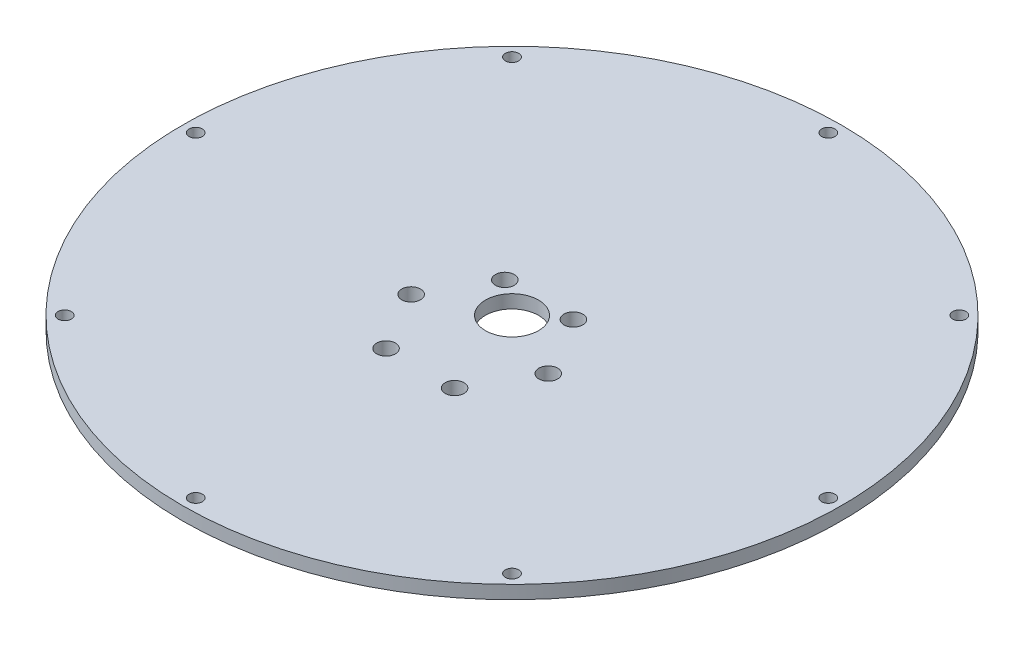
ISO-10303-21;
HEADER;
FILE_DESCRIPTION(('STEP AP214'),'2;1');
FILE_NAME('part.step','',(''),(''),'','','');
FILE_SCHEMA(('AUTOMOTIVE_DESIGN { 1 0 10303 214 1 1 1 1 }'));
ENDSEC;
DATA;
#1=APPLICATION_CONTEXT('core data for automotive mechanical design processes');
#2=APPLICATION_PROTOCOL_DEFINITION('international standard','automotive_design',2000,#1);
#3=PRODUCT_CONTEXT('',#1,'mechanical');
#4=PRODUCT('Part','Part','',(#3));
#5=PRODUCT_RELATED_PRODUCT_CATEGORY('part','',(#4));
#6=PRODUCT_DEFINITION_FORMATION('','',#4);
#7=PRODUCT_DEFINITION_CONTEXT('part definition',#1,'design');
#8=PRODUCT_DEFINITION('design','',#6,#7);
#9=PRODUCT_DEFINITION_SHAPE('','',#8);
#10=(LENGTH_UNIT() NAMED_UNIT(*) SI_UNIT(.MILLI.,.METRE.));
#11=(NAMED_UNIT(*) PLANE_ANGLE_UNIT() SI_UNIT($,.RADIAN.));
#12=(NAMED_UNIT(*) SI_UNIT($,.STERADIAN.) SOLID_ANGLE_UNIT());
#13=UNCERTAINTY_MEASURE_WITH_UNIT(LENGTH_MEASURE(1.E-05),#10,'distance_accuracy_value','');
#14=(GEOMETRIC_REPRESENTATION_CONTEXT(3) GLOBAL_UNCERTAINTY_ASSIGNED_CONTEXT((#13)) GLOBAL_UNIT_ASSIGNED_CONTEXT((#10,
#11,#12)) REPRESENTATION_CONTEXT('',''));
#15=CARTESIAN_POINT('',(0.,0.,0.));
#16=DIRECTION('',(0.,0.,1.));
#17=DIRECTION('',(1.,0.,0.));
#18=AXIS2_PLACEMENT_3D('',#15,#16,#17);
#19=CARTESIAN_POINT('',(0.,3.,0.));
#20=DIRECTION('',(0.,-1.,0.));
#21=DIRECTION('',(0.,0.,-1.));
#22=AXIS2_PLACEMENT_3D('',#19,#20,#21);
#23=CYLINDRICAL_SURFACE('',#22,5.99999999999999);
#24=CARTESIAN_POINT('',(0.,3.,0.));
#25=DIRECTION('',(0.,1.,0.));
#26=DIRECTION('',(0.,0.,1.));
#27=AXIS2_PLACEMENT_3D('',#24,#25,#26);
#28=CIRCLE('',#27,5.99999999999999);
#29=CARTESIAN_POINT('',(0.,3.,5.99999999999999));
#30=VERTEX_POINT('',#29);
#31=EDGE_CURVE('E49',#30,#30,#28,.T.);
#32=ORIENTED_EDGE('',*,*,#31,.T.);
#33=EDGE_LOOP('',(#32));
#34=FACE_BOUND('',#33,.T.);
#35=CARTESIAN_POINT('',(0.,0.,0.));
#36=DIRECTION('',(0.,1.,0.));
#37=DIRECTION('',(0.,0.,1.));
#38=AXIS2_PLACEMENT_3D('',#35,#36,#37);
#39=CIRCLE('',#38,5.99999999999999);
#40=CARTESIAN_POINT('',(0.,0.,5.99999999999999));
#41=VERTEX_POINT('',#40);
#42=EDGE_CURVE('E99',#41,#41,#39,.T.);
#43=ORIENTED_EDGE('',*,*,#42,.F.);
#44=EDGE_LOOP('',(#43));
#45=FACE_BOUND('',#44,.T.);
#46=ADVANCED_FACE('F41',(#34,#45),#23,.F.);
#47=CARTESIAN_POINT('',(7.75,3.,20.7233937586588));
#48=DIRECTION('',(0.,-1.,0.));
#49=DIRECTION('',(0.,0.,-1.));
#50=AXIS2_PLACEMENT_3D('',#47,#48,#49);
#51=CYLINDRICAL_SURFACE('',#50,2.12500000000002);
#52=CARTESIAN_POINT('',(7.75,3.,20.7233937586588));
#53=DIRECTION('',(0.,1.,0.));
#54=DIRECTION('',(0.,0.,1.));
#55=AXIS2_PLACEMENT_3D('',#52,#53,#54);
#56=CIRCLE('',#55,2.12500000000002);
#57=CARTESIAN_POINT('',(7.75,3.,22.8483937586588));
#58=VERTEX_POINT('',#57);
#59=EDGE_CURVE('E54',#58,#58,#56,.T.);
#60=ORIENTED_EDGE('',*,*,#59,.T.);
#61=EDGE_LOOP('',(#60));
#62=FACE_BOUND('',#61,.T.);
#63=CARTESIAN_POINT('',(7.75,0.,20.7233937586588));
#64=DIRECTION('',(0.,1.,0.));
#65=DIRECTION('',(0.,0.,1.));
#66=AXIS2_PLACEMENT_3D('',#63,#64,#65);
#67=CIRCLE('',#66,2.12500000000002);
#68=CARTESIAN_POINT('',(7.75,0.,22.8483937586588));
#69=VERTEX_POINT('',#68);
#70=EDGE_CURVE('E97',#69,#69,#67,.T.);
#71=ORIENTED_EDGE('',*,*,#70,.F.);
#72=EDGE_LOOP('',(#71));
#73=FACE_BOUND('',#72,.T.);
#74=ADVANCED_FACE('F150',(#62,#73),#51,.F.);
#75=CARTESIAN_POINT('',(-7.75,3.,20.7233937586588));
#76=DIRECTION('',(0.,-1.,0.));
#77=DIRECTION('',(0.,0.,-1.));
#78=AXIS2_PLACEMENT_3D('',#75,#76,#77);
#79=CYLINDRICAL_SURFACE('',#78,2.12500000000001);
#80=CARTESIAN_POINT('',(-7.75,3.,20.7233937586588));
#81=DIRECTION('',(0.,1.,0.));
#82=DIRECTION('',(0.,0.,1.));
#83=AXIS2_PLACEMENT_3D('',#80,#81,#82);
#84=CIRCLE('',#83,2.12500000000001);
#85=CARTESIAN_POINT('',(-7.75,3.,22.8483937586588));
#86=VERTEX_POINT('',#85);
#87=EDGE_CURVE('E145',#86,#86,#84,.T.);
#88=ORIENTED_EDGE('',*,*,#87,.T.);
#89=EDGE_LOOP('',(#88));
#90=FACE_BOUND('',#89,.T.);
#91=CARTESIAN_POINT('',(-7.75,0.,20.7233937586588));
#92=DIRECTION('',(0.,1.,0.));
#93=DIRECTION('',(0.,0.,1.));
#94=AXIS2_PLACEMENT_3D('',#91,#92,#93);
#95=CIRCLE('',#94,2.12500000000001);
#96=CARTESIAN_POINT('',(-7.75,0.,22.8483937586588));
#97=VERTEX_POINT('',#96);
#98=EDGE_CURVE('E94',#97,#97,#95,.T.);
#99=ORIENTED_EDGE('',*,*,#98,.F.);
#100=EDGE_LOOP('',(#99));
#101=FACE_BOUND('',#100,.T.);
#102=ADVANCED_FACE('F169',(#90,#101),#79,.F.);
#103=CARTESIAN_POINT('',(-15.5,3.,7.3));
#104=DIRECTION('',(0.,-1.,0.));
#105=DIRECTION('',(0.,0.,-1.));
#106=AXIS2_PLACEMENT_3D('',#103,#104,#105);
#107=CYLINDRICAL_SURFACE('',#106,2.125);
#108=CARTESIAN_POINT('',(-15.5,3.,7.3));
#109=DIRECTION('',(0.,1.,0.));
#110=DIRECTION('',(0.,0.,1.));
#111=AXIS2_PLACEMENT_3D('',#108,#109,#110);
#112=CIRCLE('',#111,2.125);
#113=CARTESIAN_POINT('',(-15.5,3.,9.425));
#114=VERTEX_POINT('',#113);
#115=EDGE_CURVE('E142',#114,#114,#112,.T.);
#116=ORIENTED_EDGE('',*,*,#115,.T.);
#117=EDGE_LOOP('',(#116));
#118=FACE_BOUND('',#117,.T.);
#119=CARTESIAN_POINT('',(-15.5,0.,7.3));
#120=DIRECTION('',(0.,1.,0.));
#121=DIRECTION('',(0.,0.,1.));
#122=AXIS2_PLACEMENT_3D('',#119,#120,#121);
#123=CIRCLE('',#122,2.125);
#124=CARTESIAN_POINT('',(-15.5,0.,9.425));
#125=VERTEX_POINT('',#124);
#126=EDGE_CURVE('E91',#125,#125,#123,.T.);
#127=ORIENTED_EDGE('',*,*,#126,.F.);
#128=EDGE_LOOP('',(#127));
#129=FACE_BOUND('',#128,.T.);
#130=ADVANCED_FACE('F176',(#118,#129),#107,.F.);
#131=CARTESIAN_POINT('',(-7.75000000000001,3.,-6.12339375865879));
#132=DIRECTION('',(0.,-1.,0.));
#133=DIRECTION('',(0.,0.,-1.));
#134=AXIS2_PLACEMENT_3D('',#131,#132,#133);
#135=CYLINDRICAL_SURFACE('',#134,2.12500000000001);
#136=CARTESIAN_POINT('',(-7.75000000000001,3.,-6.12339375865879));
#137=DIRECTION('',(0.,1.,0.));
#138=DIRECTION('',(0.,0.,1.));
#139=AXIS2_PLACEMENT_3D('',#136,#137,#138);
#140=CIRCLE('',#139,2.12500000000001);
#141=CARTESIAN_POINT('',(-7.75000000000001,3.,-3.99839375865878));
#142=VERTEX_POINT('',#141);
#143=EDGE_CURVE('E139',#142,#142,#140,.T.);
#144=ORIENTED_EDGE('',*,*,#143,.T.);
#145=EDGE_LOOP('',(#144));
#146=FACE_BOUND('',#145,.T.);
#147=CARTESIAN_POINT('',(-7.75000000000001,0.,-6.12339375865879));
#148=DIRECTION('',(0.,1.,0.));
#149=DIRECTION('',(0.,0.,1.));
#150=AXIS2_PLACEMENT_3D('',#147,#148,#149);
#151=CIRCLE('',#150,2.12500000000001);
#152=CARTESIAN_POINT('',(-7.75000000000001,0.,-3.99839375865878));
#153=VERTEX_POINT('',#152);
#154=EDGE_CURVE('E88',#153,#153,#151,.T.);
#155=ORIENTED_EDGE('',*,*,#154,.F.);
#156=EDGE_LOOP('',(#155));
#157=FACE_BOUND('',#156,.T.);
#158=ADVANCED_FACE('F180',(#146,#157),#135,.F.);
#159=CARTESIAN_POINT('',(7.74999999999999,3.,-6.1233937586588));
#160=DIRECTION('',(0.,-1.,0.));
#161=DIRECTION('',(0.,0.,-1.));
#162=AXIS2_PLACEMENT_3D('',#159,#160,#161);
#163=CYLINDRICAL_SURFACE('',#162,2.125);
#164=CARTESIAN_POINT('',(7.74999999999999,3.,-6.1233937586588));
#165=DIRECTION('',(0.,1.,0.));
#166=DIRECTION('',(0.,0.,1.));
#167=AXIS2_PLACEMENT_3D('',#164,#165,#166);
#168=CIRCLE('',#167,2.125);
#169=CARTESIAN_POINT('',(7.74999999999999,3.,-3.9983937586588));
#170=VERTEX_POINT('',#169);
#171=EDGE_CURVE('E136',#170,#170,#168,.T.);
#172=ORIENTED_EDGE('',*,*,#171,.T.);
#173=EDGE_LOOP('',(#172));
#174=FACE_BOUND('',#173,.T.);
#175=CARTESIAN_POINT('',(7.74999999999999,0.,-6.1233937586588));
#176=DIRECTION('',(0.,1.,0.));
#177=DIRECTION('',(0.,0.,1.));
#178=AXIS2_PLACEMENT_3D('',#175,#176,#177);
#179=CIRCLE('',#178,2.125);
#180=CARTESIAN_POINT('',(7.74999999999999,0.,-3.9983937586588));
#181=VERTEX_POINT('',#180);
#182=EDGE_CURVE('E85',#181,#181,#179,.T.);
#183=ORIENTED_EDGE('',*,*,#182,.F.);
#184=EDGE_LOOP('',(#183));
#185=FACE_BOUND('',#184,.T.);
#186=ADVANCED_FACE('F184',(#174,#185),#163,.F.);
#187=CARTESIAN_POINT('',(0.,3.,0.));
#188=DIRECTION('',(0.,-1.,0.));
#189=DIRECTION('',(0.,0.,-1.));
#190=AXIS2_PLACEMENT_3D('',#187,#188,#189);
#191=CYLINDRICAL_SURFACE('',#190,74.5);
#192=CARTESIAN_POINT('',(0.,3.,0.));
#193=DIRECTION('',(0.,1.,0.));
#194=DIRECTION('',(0.,0.,1.));
#195=AXIS2_PLACEMENT_3D('',#192,#193,#194);
#196=CIRCLE('',#195,74.5);
#197=CARTESIAN_POINT('',(0.,3.,74.5));
#198=VERTEX_POINT('',#197);
#199=EDGE_CURVE('E133',#198,#198,#196,.T.);
#200=ORIENTED_EDGE('',*,*,#199,.F.);
#201=EDGE_LOOP('',(#200));
#202=FACE_BOUND('',#201,.T.);
#203=CARTESIAN_POINT('',(0.,0.,0.));
#204=DIRECTION('',(0.,1.,0.));
#205=DIRECTION('',(0.,0.,1.));
#206=AXIS2_PLACEMENT_3D('',#203,#204,#205);
#207=CIRCLE('',#206,74.5);
#208=CARTESIAN_POINT('',(0.,0.,74.5));
#209=VERTEX_POINT('',#208);
#210=EDGE_CURVE('E82',#209,#209,#207,.T.);
#211=ORIENTED_EDGE('',*,*,#210,.T.);
#212=EDGE_LOOP('',(#211));
#213=FACE_BOUND('',#212,.T.);
#214=ADVANCED_FACE('F188',(#202,#213),#191,.T.);
#215=CARTESIAN_POINT('',(0.,3.,-71.5));
#216=DIRECTION('',(0.,-1.,0.));
#217=DIRECTION('',(0.,0.,-1.));
#218=AXIS2_PLACEMENT_3D('',#215,#216,#217);
#219=CYLINDRICAL_SURFACE('',#218,1.5);
#220=CARTESIAN_POINT('',(0.,3.,-71.5));
#221=DIRECTION('',(0.,1.,0.));
#222=DIRECTION('',(0.,0.,1.));
#223=AXIS2_PLACEMENT_3D('',#220,#221,#222);
#224=CIRCLE('',#223,1.5);
#225=CARTESIAN_POINT('',(0.,3.,-70.));
#226=VERTEX_POINT('',#225);
#227=EDGE_CURVE('E130',#226,#226,#224,.T.);
#228=ORIENTED_EDGE('',*,*,#227,.T.);
#229=EDGE_LOOP('',(#228));
#230=FACE_BOUND('',#229,.T.);
#231=CARTESIAN_POINT('',(0.,0.,-71.5));
#232=DIRECTION('',(0.,1.,0.));
#233=DIRECTION('',(0.,0.,1.));
#234=AXIS2_PLACEMENT_3D('',#231,#232,#233);
#235=CIRCLE('',#234,1.5);
#236=CARTESIAN_POINT('',(0.,0.,-70.));
#237=VERTEX_POINT('',#236);
#238=EDGE_CURVE('E79',#237,#237,#235,.T.);
#239=ORIENTED_EDGE('',*,*,#238,.F.);
#240=EDGE_LOOP('',(#239));
#241=FACE_BOUND('',#240,.T.);
#242=ADVANCED_FACE('F192',(#230,#241),#219,.F.);
#243=CARTESIAN_POINT('',(50.5581348548386,3.,-50.5581348548393));
#244=DIRECTION('',(0.,-1.,0.));
#245=DIRECTION('',(0.,0.,-1.));
#246=AXIS2_PLACEMENT_3D('',#243,#244,#245);
#247=CYLINDRICAL_SURFACE('',#246,1.5);
#248=CARTESIAN_POINT('',(50.5581348548386,3.,-50.5581348548393));
#249=DIRECTION('',(0.,1.,0.));
#250=DIRECTION('',(0.,0.,1.));
#251=AXIS2_PLACEMENT_3D('',#248,#249,#250);
#252=CIRCLE('',#251,1.5);
#253=CARTESIAN_POINT('',(50.5581348548386,3.,-49.0581348548393));
#254=VERTEX_POINT('',#253);
#255=EDGE_CURVE('E127',#254,#254,#252,.T.);
#256=ORIENTED_EDGE('',*,*,#255,.T.);
#257=EDGE_LOOP('',(#256));
#258=FACE_BOUND('',#257,.T.);
#259=CARTESIAN_POINT('',(50.5581348548386,0.,-50.5581348548393));
#260=DIRECTION('',(0.,1.,0.));
#261=DIRECTION('',(0.,0.,1.));
#262=AXIS2_PLACEMENT_3D('',#259,#260,#261);
#263=CIRCLE('',#262,1.5);
#264=CARTESIAN_POINT('',(50.5581348548386,0.,-49.0581348548393));
#265=VERTEX_POINT('',#264);
#266=EDGE_CURVE('E76',#265,#265,#263,.T.);
#267=ORIENTED_EDGE('',*,*,#266,.F.);
#268=EDGE_LOOP('',(#267));
#269=FACE_BOUND('',#268,.T.);
#270=ADVANCED_FACE('F196',(#258,#269),#247,.F.);
#271=CARTESIAN_POINT('',(71.5000000000017,3.,-1.69988350373801E-12));
#272=DIRECTION('',(0.,-1.,0.));
#273=DIRECTION('',(0.,0.,-1.));
#274=AXIS2_PLACEMENT_3D('',#271,#272,#273);
#275=CYLINDRICAL_SURFACE('',#274,1.5);
#276=CARTESIAN_POINT('',(71.5000000000017,3.,-1.69988350373801E-12));
#277=DIRECTION('',(0.,1.,0.));
#278=DIRECTION('',(0.,0.,1.));
#279=AXIS2_PLACEMENT_3D('',#276,#277,#278);
#280=CIRCLE('',#279,1.5);
#281=CARTESIAN_POINT('',(71.5000000000017,3.,1.4999999999983));
#282=VERTEX_POINT('',#281);
#283=EDGE_CURVE('E124',#282,#282,#280,.T.);
#284=ORIENTED_EDGE('',*,*,#283,.T.);
#285=EDGE_LOOP('',(#284));
#286=FACE_BOUND('',#285,.T.);
#287=CARTESIAN_POINT('',(71.5000000000017,0.,-1.69988350373801E-12));
#288=DIRECTION('',(0.,1.,0.));
#289=DIRECTION('',(0.,0.,1.));
#290=AXIS2_PLACEMENT_3D('',#287,#288,#289);
#291=CIRCLE('',#290,1.5);
#292=CARTESIAN_POINT('',(71.5000000000017,0.,1.4999999999983));
#293=VERTEX_POINT('',#292);
#294=EDGE_CURVE('E73',#293,#293,#291,.T.);
#295=ORIENTED_EDGE('',*,*,#294,.F.);
#296=EDGE_LOOP('',(#295));
#297=FACE_BOUND('',#296,.T.);
#298=ADVANCED_FACE('F200',(#286,#297),#275,.F.);
#299=CARTESIAN_POINT('',(50.558134854841,3.,50.5581348548369));
#300=DIRECTION('',(0.,-1.,0.));
#301=DIRECTION('',(0.,0.,-1.));
#302=AXIS2_PLACEMENT_3D('',#299,#300,#301);
#303=CYLINDRICAL_SURFACE('',#302,1.5);
#304=CARTESIAN_POINT('',(50.558134854841,3.,50.5581348548369));
#305=DIRECTION('',(0.,1.,0.));
#306=DIRECTION('',(0.,0.,1.));
#307=AXIS2_PLACEMENT_3D('',#304,#305,#306);
#308=CIRCLE('',#307,1.5);
#309=CARTESIAN_POINT('',(50.558134854841,3.,52.0581348548369));
#310=VERTEX_POINT('',#309);
#311=EDGE_CURVE('E121',#310,#310,#308,.T.);
#312=ORIENTED_EDGE('',*,*,#311,.T.);
#313=EDGE_LOOP('',(#312));
#314=FACE_BOUND('',#313,.T.);
#315=CARTESIAN_POINT('',(50.558134854841,0.,50.5581348548369));
#316=DIRECTION('',(0.,1.,0.));
#317=DIRECTION('',(0.,0.,1.));
#318=AXIS2_PLACEMENT_3D('',#315,#316,#317);
#319=CIRCLE('',#318,1.5);
#320=CARTESIAN_POINT('',(50.558134854841,0.,52.0581348548369));
#321=VERTEX_POINT('',#320);
#322=EDGE_CURVE('E70',#321,#321,#319,.T.);
#323=ORIENTED_EDGE('',*,*,#322,.F.);
#324=EDGE_LOOP('',(#323));
#325=FACE_BOUND('',#324,.T.);
#326=ADVANCED_FACE('F204',(#314,#325),#303,.F.);
#327=CARTESIAN_POINT('',(3.39976700747603E-12,3.,71.5));
#328=DIRECTION('',(0.,-1.,0.));
#329=DIRECTION('',(0.,0.,-1.));
#330=AXIS2_PLACEMENT_3D('',#327,#328,#329);
#331=CYLINDRICAL_SURFACE('',#330,1.5);
#332=CARTESIAN_POINT('',(3.39976700747603E-12,3.,71.5));
#333=DIRECTION('',(0.,1.,0.));
#334=DIRECTION('',(0.,0.,1.));
#335=AXIS2_PLACEMENT_3D('',#332,#333,#334);
#336=CIRCLE('',#335,1.5);
#337=CARTESIAN_POINT('',(3.39976700747603E-12,3.,73.));
#338=VERTEX_POINT('',#337);
#339=EDGE_CURVE('E118',#338,#338,#336,.T.);
#340=ORIENTED_EDGE('',*,*,#339,.T.);
#341=EDGE_LOOP('',(#340));
#342=FACE_BOUND('',#341,.T.);
#343=CARTESIAN_POINT('',(3.39976700747603E-12,0.,71.5));
#344=DIRECTION('',(0.,1.,0.));
#345=DIRECTION('',(0.,0.,1.));
#346=AXIS2_PLACEMENT_3D('',#343,#344,#345);
#347=CIRCLE('',#346,1.5);
#348=CARTESIAN_POINT('',(3.39976700747603E-12,0.,73.));
#349=VERTEX_POINT('',#348);
#350=EDGE_CURVE('E67',#349,#349,#347,.T.);
#351=ORIENTED_EDGE('',*,*,#350,.F.);
#352=EDGE_LOOP('',(#351));
#353=FACE_BOUND('',#352,.T.);
#354=ADVANCED_FACE('F208',(#342,#353),#331,.F.);
#355=CARTESIAN_POINT('',(-50.5581348548353,3.,50.5581348548394));
#356=DIRECTION('',(0.,-1.,0.));
#357=DIRECTION('',(0.,0.,-1.));
#358=AXIS2_PLACEMENT_3D('',#355,#356,#357);
#359=CYLINDRICAL_SURFACE('',#358,1.5);
#360=CARTESIAN_POINT('',(-50.5581348548353,3.,50.5581348548394));
#361=DIRECTION('',(0.,1.,0.));
#362=DIRECTION('',(0.,0.,1.));
#363=AXIS2_PLACEMENT_3D('',#360,#361,#362);
#364=CIRCLE('',#363,1.5);
#365=CARTESIAN_POINT('',(-50.5581348548353,3.,52.0581348548394));
#366=VERTEX_POINT('',#365);
#367=EDGE_CURVE('E113',#366,#366,#364,.T.);
#368=ORIENTED_EDGE('',*,*,#367,.T.);
#369=EDGE_LOOP('',(#368));
#370=FACE_BOUND('',#369,.T.);
#371=CARTESIAN_POINT('',(-50.5581348548353,0.,50.5581348548394));
#372=DIRECTION('',(0.,1.,0.));
#373=DIRECTION('',(0.,0.,1.));
#374=AXIS2_PLACEMENT_3D('',#371,#372,#373);
#375=CIRCLE('',#374,1.5);
#376=CARTESIAN_POINT('',(-50.5581348548353,0.,52.0581348548394));
#377=VERTEX_POINT('',#376);
#378=EDGE_CURVE('E64',#377,#377,#375,.T.);
#379=ORIENTED_EDGE('',*,*,#378,.F.);
#380=EDGE_LOOP('',(#379));
#381=FACE_BOUND('',#380,.T.);
#382=ADVANCED_FACE('F212',(#370,#381),#359,.F.);
#383=CARTESIAN_POINT('',(-71.4999999999983,3.,1.70863972835192E-12));
#384=DIRECTION('',(0.,-1.,0.));
#385=DIRECTION('',(0.,0.,-1.));
#386=AXIS2_PLACEMENT_3D('',#383,#384,#385);
#387=CYLINDRICAL_SURFACE('',#386,1.5);
#388=CARTESIAN_POINT('',(-71.4999999999983,3.,1.70863972835192E-12));
#389=DIRECTION('',(0.,1.,0.));
#390=DIRECTION('',(0.,0.,1.));
#391=AXIS2_PLACEMENT_3D('',#388,#389,#390);
#392=CIRCLE('',#391,1.5);
#393=CARTESIAN_POINT('',(-71.4999999999983,3.,1.50000000000171));
#394=VERTEX_POINT('',#393);
#395=EDGE_CURVE('E108',#394,#394,#392,.T.);
#396=ORIENTED_EDGE('',*,*,#395,.T.);
#397=EDGE_LOOP('',(#396));
#398=FACE_BOUND('',#397,.T.);
#399=CARTESIAN_POINT('',(-71.4999999999983,0.,1.70863972835192E-12));
#400=DIRECTION('',(0.,1.,0.));
#401=DIRECTION('',(0.,0.,1.));
#402=AXIS2_PLACEMENT_3D('',#399,#400,#401);
#403=CIRCLE('',#402,1.5);
#404=CARTESIAN_POINT('',(-71.4999999999983,0.,1.50000000000171));
#405=VERTEX_POINT('',#404);
#406=EDGE_CURVE('E61',#405,#405,#403,.T.);
#407=ORIENTED_EDGE('',*,*,#406,.F.);
#408=EDGE_LOOP('',(#407));
#409=FACE_BOUND('',#408,.T.);
#410=ADVANCED_FACE('F215',(#398,#409),#387,.F.);
#411=CARTESIAN_POINT('',(-50.5581348548377,3.,-50.5581348548369));
#412=DIRECTION('',(0.,-1.,0.));
#413=DIRECTION('',(0.,0.,-1.));
#414=AXIS2_PLACEMENT_3D('',#411,#412,#413);
#415=CYLINDRICAL_SURFACE('',#414,1.5);
#416=CARTESIAN_POINT('',(-50.5581348548377,3.,-50.5581348548369));
#417=DIRECTION('',(0.,1.,0.));
#418=DIRECTION('',(0.,0.,1.));
#419=AXIS2_PLACEMENT_3D('',#416,#417,#418);
#420=CIRCLE('',#419,1.5);
#421=CARTESIAN_POINT('',(-50.5581348548377,3.,-49.0581348548369));
#422=VERTEX_POINT('',#421);
#423=EDGE_CURVE('E104',#422,#422,#420,.T.);
#424=ORIENTED_EDGE('',*,*,#423,.T.);
#425=EDGE_LOOP('',(#424));
#426=FACE_BOUND('',#425,.T.);
#427=CARTESIAN_POINT('',(-50.5581348548377,0.,-50.5581348548369));
#428=DIRECTION('',(0.,1.,0.));
#429=DIRECTION('',(0.,0.,1.));
#430=AXIS2_PLACEMENT_3D('',#427,#428,#429);
#431=CIRCLE('',#430,1.5);
#432=CARTESIAN_POINT('',(-50.5581348548377,0.,-49.0581348548369));
#433=VERTEX_POINT('',#432);
#434=EDGE_CURVE('E58',#433,#433,#431,.T.);
#435=ORIENTED_EDGE('',*,*,#434,.F.);
#436=EDGE_LOOP('',(#435));
#437=FACE_BOUND('',#436,.T.);
#438=ADVANCED_FACE('F43',(#426,#437),#415,.F.);
#439=CARTESIAN_POINT('',(15.5,3.,7.3));
#440=DIRECTION('',(0.,-1.,0.));
#441=DIRECTION('',(0.,0.,-1.));
#442=AXIS2_PLACEMENT_3D('',#439,#440,#441);
#443=CYLINDRICAL_SURFACE('',#442,2.125);
#444=CARTESIAN_POINT('',(15.5,3.,7.3));
#445=DIRECTION('',(0.,1.,0.));
#446=DIRECTION('',(0.,0.,1.));
#447=AXIS2_PLACEMENT_3D('',#444,#445,#446);
#448=CIRCLE('',#447,2.125);
#449=CARTESIAN_POINT('',(15.5,3.,9.425));
#450=VERTEX_POINT('',#449);
#451=EDGE_CURVE('E10',#450,#450,#448,.T.);
#452=ORIENTED_EDGE('',*,*,#451,.T.);
#453=EDGE_LOOP('',(#452));
#454=FACE_BOUND('',#453,.T.);
#455=CARTESIAN_POINT('',(15.5,0.,7.3));
#456=DIRECTION('',(0.,1.,0.));
#457=DIRECTION('',(0.,0.,1.));
#458=AXIS2_PLACEMENT_3D('',#455,#456,#457);
#459=CIRCLE('',#458,2.125);
#460=CARTESIAN_POINT('',(15.5,0.,9.425));
#461=VERTEX_POINT('',#460);
#462=EDGE_CURVE('E45',#461,#461,#459,.T.);
#463=ORIENTED_EDGE('',*,*,#462,.F.);
#464=EDGE_LOOP('',(#463));
#465=FACE_BOUND('',#464,.T.);
#466=ADVANCED_FACE('F157',(#454,#465),#443,.F.);
#467=CARTESIAN_POINT('',(0.,3.,0.));
#468=DIRECTION('',(0.,1.,0.));
#469=DIRECTION('',(0.,0.,1.));
#470=AXIS2_PLACEMENT_3D('',#467,#468,#469);
#471=PLANE('',#470);
#472=ORIENTED_EDGE('',*,*,#423,.F.);
#473=EDGE_LOOP('',(#472));
#474=FACE_BOUND('',#473,.T.);
#475=ORIENTED_EDGE('',*,*,#395,.F.);
#476=EDGE_LOOP('',(#475));
#477=FACE_BOUND('',#476,.T.);
#478=ORIENTED_EDGE('',*,*,#367,.F.);
#479=EDGE_LOOP('',(#478));
#480=FACE_BOUND('',#479,.T.);
#481=ORIENTED_EDGE('',*,*,#339,.F.);
#482=EDGE_LOOP('',(#481));
#483=FACE_BOUND('',#482,.T.);
#484=ORIENTED_EDGE('',*,*,#311,.F.);
#485=EDGE_LOOP('',(#484));
#486=FACE_BOUND('',#485,.T.);
#487=ORIENTED_EDGE('',*,*,#283,.F.);
#488=EDGE_LOOP('',(#487));
#489=FACE_BOUND('',#488,.T.);
#490=ORIENTED_EDGE('',*,*,#255,.F.);
#491=EDGE_LOOP('',(#490));
#492=FACE_BOUND('',#491,.T.);
#493=ORIENTED_EDGE('',*,*,#227,.F.);
#494=EDGE_LOOP('',(#493));
#495=FACE_BOUND('',#494,.T.);
#496=ORIENTED_EDGE('',*,*,#199,.T.);
#497=EDGE_LOOP('',(#496));
#498=FACE_BOUND('',#497,.T.);
#499=ORIENTED_EDGE('',*,*,#171,.F.);
#500=EDGE_LOOP('',(#499));
#501=FACE_BOUND('',#500,.T.);
#502=ORIENTED_EDGE('',*,*,#143,.F.);
#503=EDGE_LOOP('',(#502));
#504=FACE_BOUND('',#503,.T.);
#505=ORIENTED_EDGE('',*,*,#115,.F.);
#506=EDGE_LOOP('',(#505));
#507=FACE_BOUND('',#506,.T.);
#508=ORIENTED_EDGE('',*,*,#87,.F.);
#509=EDGE_LOOP('',(#508));
#510=FACE_BOUND('',#509,.T.);
#511=ORIENTED_EDGE('',*,*,#59,.F.);
#512=EDGE_LOOP('',(#511));
#513=FACE_BOUND('',#512,.T.);
#514=ORIENTED_EDGE('',*,*,#31,.F.);
#515=EDGE_LOOP('',(#514));
#516=FACE_BOUND('',#515,.T.);
#517=ORIENTED_EDGE('',*,*,#451,.F.);
#518=EDGE_LOOP('',(#517));
#519=FACE_BOUND('',#518,.T.);
#520=ADVANCED_FACE('F153',(#474,#477,#480,#483,#486,#489,#492,#495,#498,#501,#504,#507,#510,
#513,#516,#519),#471,.T.);
#521=CARTESIAN_POINT('',(0.,0.,0.));
#522=DIRECTION('',(0.,1.,0.));
#523=DIRECTION('',(0.,0.,1.));
#524=AXIS2_PLACEMENT_3D('',#521,#522,#523);
#525=PLANE('',#524);
#526=ORIENTED_EDGE('',*,*,#434,.T.);
#527=EDGE_LOOP('',(#526));
#528=FACE_BOUND('',#527,.T.);
#529=ORIENTED_EDGE('',*,*,#406,.T.);
#530=EDGE_LOOP('',(#529));
#531=FACE_BOUND('',#530,.T.);
#532=ORIENTED_EDGE('',*,*,#378,.T.);
#533=EDGE_LOOP('',(#532));
#534=FACE_BOUND('',#533,.T.);
#535=ORIENTED_EDGE('',*,*,#350,.T.);
#536=EDGE_LOOP('',(#535));
#537=FACE_BOUND('',#536,.T.);
#538=ORIENTED_EDGE('',*,*,#322,.T.);
#539=EDGE_LOOP('',(#538));
#540=FACE_BOUND('',#539,.T.);
#541=ORIENTED_EDGE('',*,*,#294,.T.);
#542=EDGE_LOOP('',(#541));
#543=FACE_BOUND('',#542,.T.);
#544=ORIENTED_EDGE('',*,*,#266,.T.);
#545=EDGE_LOOP('',(#544));
#546=FACE_BOUND('',#545,.T.);
#547=ORIENTED_EDGE('',*,*,#238,.T.);
#548=EDGE_LOOP('',(#547));
#549=FACE_BOUND('',#548,.T.);
#550=ORIENTED_EDGE('',*,*,#210,.F.);
#551=EDGE_LOOP('',(#550));
#552=FACE_BOUND('',#551,.T.);
#553=ORIENTED_EDGE('',*,*,#182,.T.);
#554=EDGE_LOOP('',(#553));
#555=FACE_BOUND('',#554,.T.);
#556=ORIENTED_EDGE('',*,*,#154,.T.);
#557=EDGE_LOOP('',(#556));
#558=FACE_BOUND('',#557,.T.);
#559=ORIENTED_EDGE('',*,*,#126,.T.);
#560=EDGE_LOOP('',(#559));
#561=FACE_BOUND('',#560,.T.);
#562=ORIENTED_EDGE('',*,*,#98,.T.);
#563=EDGE_LOOP('',(#562));
#564=FACE_BOUND('',#563,.T.);
#565=ORIENTED_EDGE('',*,*,#70,.T.);
#566=EDGE_LOOP('',(#565));
#567=FACE_BOUND('',#566,.T.);
#568=ORIENTED_EDGE('',*,*,#42,.T.);
#569=EDGE_LOOP('',(#568));
#570=FACE_BOUND('',#569,.T.);
#571=ORIENTED_EDGE('',*,*,#462,.T.);
#572=EDGE_LOOP('',(#571));
#573=FACE_BOUND('',#572,.T.);
#574=ADVANCED_FACE('F156',(#528,#531,#534,#537,#540,#543,#546,#549,#552,#555,#558,#561,#564,
#567,#570,#573),#525,.F.);
#575=CLOSED_SHELL('',(#46,#74,#102,#130,#158,#186,#214,#242,#270,#298,#326,#354,#382,#410,#438,
#466,#520,#574));
#576=MANIFOLD_SOLID_BREP('B2',#575);
#577=ADVANCED_BREP_SHAPE_REPRESENTATION('',(#18,#576),#14);
#578=SHAPE_DEFINITION_REPRESENTATION(#9,#577);
ENDSEC;
END-ISO-10303-21;
